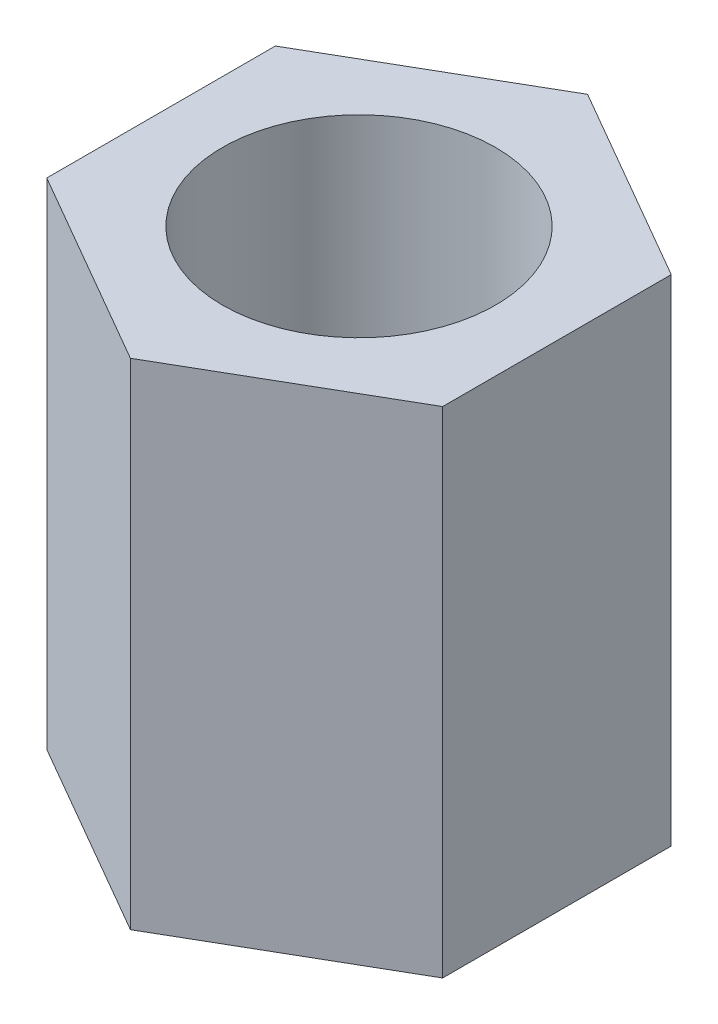
ISO-10303-21;
HEADER;
FILE_DESCRIPTION(('STEP AP214'),'2;1');
FILE_NAME('part.step','',(''),(''),'','','');
FILE_SCHEMA(('AUTOMOTIVE_DESIGN { 1 0 10303 214 1 1 1 1 }'));
ENDSEC;
DATA;
#1=APPLICATION_CONTEXT('core data for automotive mechanical design processes');
#2=APPLICATION_PROTOCOL_DEFINITION('international standard','automotive_design',2000,#1);
#3=PRODUCT_CONTEXT('',#1,'mechanical');
#4=PRODUCT('Part','Part','',(#3));
#5=PRODUCT_RELATED_PRODUCT_CATEGORY('part','',(#4));
#6=PRODUCT_DEFINITION_FORMATION('','',#4);
#7=PRODUCT_DEFINITION_CONTEXT('part definition',#1,'design');
#8=PRODUCT_DEFINITION('design','',#6,#7);
#9=PRODUCT_DEFINITION_SHAPE('','',#8);
#10=(LENGTH_UNIT() NAMED_UNIT(*) SI_UNIT(.MILLI.,.METRE.));
#11=(NAMED_UNIT(*) PLANE_ANGLE_UNIT() SI_UNIT($,.RADIAN.));
#12=(NAMED_UNIT(*) SI_UNIT($,.STERADIAN.) SOLID_ANGLE_UNIT());
#13=UNCERTAINTY_MEASURE_WITH_UNIT(LENGTH_MEASURE(1.E-05),#10,'distance_accuracy_value','');
#14=(GEOMETRIC_REPRESENTATION_CONTEXT(3) GLOBAL_UNCERTAINTY_ASSIGNED_CONTEXT((#13)) GLOBAL_UNIT_ASSIGNED_CONTEXT((#10,
#11,#12)) REPRESENTATION_CONTEXT('',''));
#15=CARTESIAN_POINT('',(0.,0.,0.));
#16=DIRECTION('',(0.,0.,1.));
#17=DIRECTION('',(1.,0.,0.));
#18=AXIS2_PLACEMENT_3D('',#15,#16,#17);
#19=CARTESIAN_POINT('',(0.,6.35,0.));
#20=DIRECTION('',(0.,1.,0.));
#21=DIRECTION('',(0.,0.,1.));
#22=AXIS2_PLACEMENT_3D('',#19,#20,#21);
#23=PLANE('',#22);
#24=DIRECTION('',(-0.866025403784442,0.,-0.499999999999995));
#25=VECTOR('',#24,1.);
#26=CARTESIAN_POINT('',(2.53999999999998,6.35,-1.46646968374168));
#27=LINE('',#26,#25);
#28=CARTESIAN_POINT('',(2.53999999999998,6.35,-1.46646968374168));
#29=VERTEX_POINT('',#28);
#30=CARTESIAN_POINT('',(0.,6.35,-2.93293936748329));
#31=VERTEX_POINT('',#30);
#32=EDGE_CURVE('E129',#29,#31,#27,.T.);
#33=ORIENTED_EDGE('',*,*,#32,.T.);
#34=DIRECTION('',(-0.866025403784438,0.,0.500000000000001));
#35=VECTOR('',#34,1.);
#36=CARTESIAN_POINT('',(0.,6.35,-2.93293936748329));
#37=LINE('',#36,#35);
#38=CARTESIAN_POINT('',(-2.54,6.35,-1.46646968374164));
#39=VERTEX_POINT('',#38);
#40=EDGE_CURVE('E87',#31,#39,#37,.T.);
#41=ORIENTED_EDGE('',*,*,#40,.T.);
#42=DIRECTION('',(0.,0.,1.));
#43=VECTOR('',#42,1.);
#44=CARTESIAN_POINT('',(-2.54,6.35,-1.46646968374164));
#45=LINE('',#44,#43);
#46=CARTESIAN_POINT('',(-2.53999999999999,6.35,1.46646968374166));
#47=VERTEX_POINT('',#46);
#48=EDGE_CURVE('E100',#39,#47,#45,.T.);
#49=ORIENTED_EDGE('',*,*,#48,.T.);
#50=DIRECTION('',(0.866025403784442,0.,0.499999999999995));
#51=VECTOR('',#50,1.);
#52=CARTESIAN_POINT('',(-2.53999999999999,6.35,1.46646968374166));
#53=LINE('',#52,#51);
#54=CARTESIAN_POINT('',(0.,6.35,2.93293936748329));
#55=VERTEX_POINT('',#54);
#56=EDGE_CURVE('E94',#47,#55,#53,.T.);
#57=ORIENTED_EDGE('',*,*,#56,.T.);
#58=DIRECTION('',(0.866025403784435,0.,-0.500000000000007));
#59=VECTOR('',#58,1.);
#60=CARTESIAN_POINT('',(0.,6.35,2.93293936748329));
#61=LINE('',#60,#59);
#62=CARTESIAN_POINT('',(2.54000000000001,6.35,1.46646968374162));
#63=VERTEX_POINT('',#62);
#64=EDGE_CURVE('E98',#55,#63,#61,.T.);
#65=ORIENTED_EDGE('',*,*,#64,.T.);
#66=DIRECTION('',(0.,0.,-1.));
#67=VECTOR('',#66,1.);
#68=CARTESIAN_POINT('',(2.54000000000001,6.35,1.46646968374162));
#69=LINE('',#68,#67);
#70=EDGE_CURVE('E50',#63,#29,#69,.T.);
#71=ORIENTED_EDGE('',*,*,#70,.T.);
#72=EDGE_LOOP('',(#33,#41,#49,#57,#65,#71));
#73=FACE_BOUND('',#72,.T.);
#74=CARTESIAN_POINT('',(0.,6.35,0.));
#75=DIRECTION('',(0.,1.,0.));
#76=DIRECTION('',(0.,0.,1.));
#77=AXIS2_PLACEMENT_3D('',#74,#75,#76);
#78=CIRCLE('',#77,1.7526);
#79=CARTESIAN_POINT('',(0.,6.35,1.7526));
#80=VERTEX_POINT('',#79);
#81=EDGE_CURVE('E122',#80,#80,#78,.T.);
#82=ORIENTED_EDGE('',*,*,#81,.F.);
#83=EDGE_LOOP('',(#82));
#84=FACE_BOUND('',#83,.T.);
#85=ADVANCED_FACE('F33',(#73,#84),#23,.T.);
#86=CARTESIAN_POINT('',(0.,0.,0.));
#87=DIRECTION('',(0.,1.,0.));
#88=DIRECTION('',(0.,0.,1.));
#89=AXIS2_PLACEMENT_3D('',#86,#87,#88);
#90=PLANE('',#89);
#91=DIRECTION('',(-0.866025403784442,0.,-0.499999999999995));
#92=VECTOR('',#91,1.);
#93=CARTESIAN_POINT('',(2.53999999999998,0.,-1.46646968374168));
#94=LINE('',#93,#92);
#95=CARTESIAN_POINT('',(2.53999999999998,0.,-1.46646968374168));
#96=VERTEX_POINT('',#95);
#97=CARTESIAN_POINT('',(0.,0.,-2.93293936748329));
#98=VERTEX_POINT('',#97);
#99=EDGE_CURVE('E118',#96,#98,#94,.T.);
#100=ORIENTED_EDGE('',*,*,#99,.F.);
#101=DIRECTION('',(0.,0.,-1.));
#102=VECTOR('',#101,1.);
#103=CARTESIAN_POINT('',(2.54000000000001,0.,1.46646968374162));
#104=LINE('',#103,#102);
#105=CARTESIAN_POINT('',(2.54000000000001,0.,1.46646968374162));
#106=VERTEX_POINT('',#105);
#107=EDGE_CURVE('E79',#106,#96,#104,.T.);
#108=ORIENTED_EDGE('',*,*,#107,.F.);
#109=DIRECTION('',(0.866025403784435,0.,-0.500000000000007));
#110=VECTOR('',#109,1.);
#111=CARTESIAN_POINT('',(0.,0.,2.93293936748329));
#112=LINE('',#111,#110);
#113=CARTESIAN_POINT('',(0.,0.,2.93293936748329));
#114=VERTEX_POINT('',#113);
#115=EDGE_CURVE('E73',#114,#106,#112,.T.);
#116=ORIENTED_EDGE('',*,*,#115,.F.);
#117=DIRECTION('',(0.866025403784442,0.,0.499999999999995));
#118=VECTOR('',#117,1.);
#119=CARTESIAN_POINT('',(-2.53999999999999,0.,1.46646968374166));
#120=LINE('',#119,#118);
#121=CARTESIAN_POINT('',(-2.53999999999999,0.,1.46646968374166));
#122=VERTEX_POINT('',#121);
#123=EDGE_CURVE('E108',#122,#114,#120,.T.);
#124=ORIENTED_EDGE('',*,*,#123,.F.);
#125=DIRECTION('',(0.,0.,1.));
#126=VECTOR('',#125,1.);
#127=CARTESIAN_POINT('',(-2.54,0.,-1.46646968374164));
#128=LINE('',#127,#126);
#129=CARTESIAN_POINT('',(-2.54,0.,-1.46646968374164));
#130=VERTEX_POINT('',#129);
#131=EDGE_CURVE('E124',#130,#122,#128,.T.);
#132=ORIENTED_EDGE('',*,*,#131,.F.);
#133=DIRECTION('',(-0.866025403784438,0.,0.500000000000001));
#134=VECTOR('',#133,1.);
#135=CARTESIAN_POINT('',(0.,0.,-2.93293936748329));
#136=LINE('',#135,#134);
#137=EDGE_CURVE('E121',#98,#130,#136,.T.);
#138=ORIENTED_EDGE('',*,*,#137,.F.);
#139=EDGE_LOOP('',(#100,#108,#116,#124,#132,#138));
#140=FACE_BOUND('',#139,.T.);
#141=CARTESIAN_POINT('',(0.,0.,0.));
#142=DIRECTION('',(0.,1.,0.));
#143=DIRECTION('',(0.,0.,1.));
#144=AXIS2_PLACEMENT_3D('',#141,#142,#143);
#145=CIRCLE('',#144,1.7526);
#146=CARTESIAN_POINT('',(0.,0.,1.7526));
#147=VERTEX_POINT('',#146);
#148=EDGE_CURVE('E222',#147,#147,#145,.T.);
#149=ORIENTED_EDGE('',*,*,#148,.T.);
#150=EDGE_LOOP('',(#149));
#151=FACE_BOUND('',#150,.T.);
#152=ADVANCED_FACE('F138',(#140,#151),#90,.F.);
#153=CARTESIAN_POINT('',(2.53999999999998,6.35,-1.46646968374168));
#154=DIRECTION('',(-0.499999999999995,0.,0.866025403784442));
#155=DIRECTION('',(0.866025403784442,0.,0.499999999999995));
#156=AXIS2_PLACEMENT_3D('',#153,#154,#155);
#157=PLANE('',#156);
#158=ORIENTED_EDGE('',*,*,#99,.T.);
#159=DIRECTION('',(0.,-1.,0.));
#160=VECTOR('',#159,1.);
#161=CARTESIAN_POINT('',(0.,6.35,-2.93293936748329));
#162=LINE('',#161,#160);
#163=EDGE_CURVE('E11',#31,#98,#162,.T.);
#164=ORIENTED_EDGE('',*,*,#163,.F.);
#165=ORIENTED_EDGE('',*,*,#32,.F.);
#166=DIRECTION('',(0.,-1.,0.));
#167=VECTOR('',#166,1.);
#168=CARTESIAN_POINT('',(2.53999999999998,6.35,-1.46646968374168));
#169=LINE('',#168,#167);
#170=EDGE_CURVE('E114',#29,#96,#169,.T.);
#171=ORIENTED_EDGE('',*,*,#170,.T.);
#172=EDGE_LOOP('',(#158,#164,#165,#171));
#173=FACE_BOUND('',#172,.T.);
#174=ADVANCED_FACE('F35',(#173),#157,.F.);
#175=CARTESIAN_POINT('',(0.,6.35,-2.93293936748329));
#176=DIRECTION('',(0.500000000000001,0.,0.866025403784438));
#177=DIRECTION('',(0.866025403784438,0.,-0.500000000000001));
#178=AXIS2_PLACEMENT_3D('',#175,#176,#177);
#179=PLANE('',#178);
#180=ORIENTED_EDGE('',*,*,#137,.T.);
#181=DIRECTION('',(0.,-1.,0.));
#182=VECTOR('',#181,1.);
#183=CARTESIAN_POINT('',(-2.54,6.35,-1.46646968374164));
#184=LINE('',#183,#182);
#185=EDGE_CURVE('E42',#39,#130,#184,.T.);
#186=ORIENTED_EDGE('',*,*,#185,.F.);
#187=ORIENTED_EDGE('',*,*,#40,.F.);
#188=ORIENTED_EDGE('',*,*,#163,.T.);
#189=EDGE_LOOP('',(#180,#186,#187,#188));
#190=FACE_BOUND('',#189,.T.);
#191=ADVANCED_FACE('F163',(#190),#179,.F.);
#192=CARTESIAN_POINT('',(-2.54,6.35,-1.46646968374164));
#193=DIRECTION('',(1.,0.,0.));
#194=DIRECTION('',(0.,0.,-1.));
#195=AXIS2_PLACEMENT_3D('',#192,#193,#194);
#196=PLANE('',#195);
#197=ORIENTED_EDGE('',*,*,#131,.T.);
#198=DIRECTION('',(0.,-1.,0.));
#199=VECTOR('',#198,1.);
#200=CARTESIAN_POINT('',(-2.53999999999999,6.35,1.46646968374166));
#201=LINE('',#200,#199);
#202=EDGE_CURVE('E109',#47,#122,#201,.T.);
#203=ORIENTED_EDGE('',*,*,#202,.F.);
#204=ORIENTED_EDGE('',*,*,#48,.F.);
#205=ORIENTED_EDGE('',*,*,#185,.T.);
#206=EDGE_LOOP('',(#197,#203,#204,#205));
#207=FACE_BOUND('',#206,.T.);
#208=ADVANCED_FACE('F135',(#207),#196,.F.);
#209=CARTESIAN_POINT('',(-2.53999999999999,6.35,1.46646968374166));
#210=DIRECTION('',(0.499999999999995,0.,-0.866025403784441));
#211=DIRECTION('',(-0.866025403784442,0.,-0.499999999999995));
#212=AXIS2_PLACEMENT_3D('',#209,#210,#211);
#213=PLANE('',#212);
#214=ORIENTED_EDGE('',*,*,#123,.T.);
#215=DIRECTION('',(0.,-1.,0.));
#216=VECTOR('',#215,1.);
#217=CARTESIAN_POINT('',(0.,6.35,2.93293936748329));
#218=LINE('',#217,#216);
#219=EDGE_CURVE('E105',#55,#114,#218,.T.);
#220=ORIENTED_EDGE('',*,*,#219,.F.);
#221=ORIENTED_EDGE('',*,*,#56,.F.);
#222=ORIENTED_EDGE('',*,*,#202,.T.);
#223=EDGE_LOOP('',(#214,#220,#221,#222));
#224=FACE_BOUND('',#223,.T.);
#225=ADVANCED_FACE('F106',(#224),#213,.F.);
#226=CARTESIAN_POINT('',(0.,6.35,2.93293936748329));
#227=DIRECTION('',(-0.500000000000007,0.,-0.866025403784435));
#228=DIRECTION('',(-0.866025403784435,0.,0.500000000000007));
#229=AXIS2_PLACEMENT_3D('',#226,#227,#228);
#230=PLANE('',#229);
#231=ORIENTED_EDGE('',*,*,#115,.T.);
#232=DIRECTION('',(0.,-1.,0.));
#233=VECTOR('',#232,1.);
#234=CARTESIAN_POINT('',(2.54000000000001,6.35,1.46646968374162));
#235=LINE('',#234,#233);
#236=EDGE_CURVE('E110',#63,#106,#235,.T.);
#237=ORIENTED_EDGE('',*,*,#236,.F.);
#238=ORIENTED_EDGE('',*,*,#64,.F.);
#239=ORIENTED_EDGE('',*,*,#219,.T.);
#240=EDGE_LOOP('',(#231,#237,#238,#239));
#241=FACE_BOUND('',#240,.T.);
#242=ADVANCED_FACE('F112',(#241),#230,.F.);
#243=CARTESIAN_POINT('',(2.54000000000001,6.35,1.46646968374162));
#244=DIRECTION('',(-1.,0.,0.));
#245=DIRECTION('',(0.,0.,1.));
#246=AXIS2_PLACEMENT_3D('',#243,#244,#245);
#247=PLANE('',#246);
#248=ORIENTED_EDGE('',*,*,#107,.T.);
#249=ORIENTED_EDGE('',*,*,#170,.F.);
#250=ORIENTED_EDGE('',*,*,#70,.F.);
#251=ORIENTED_EDGE('',*,*,#236,.T.);
#252=EDGE_LOOP('',(#248,#249,#250,#251));
#253=FACE_BOUND('',#252,.T.);
#254=ADVANCED_FACE('F143',(#253),#247,.F.);
#255=CARTESIAN_POINT('',(0.,6.35,0.));
#256=DIRECTION('',(0.,-1.,0.));
#257=DIRECTION('',(0.,0.,-1.));
#258=AXIS2_PLACEMENT_3D('',#255,#256,#257);
#259=CYLINDRICAL_SURFACE('',#258,1.7526);
#260=ORIENTED_EDGE('',*,*,#81,.T.);
#261=EDGE_LOOP('',(#260));
#262=FACE_BOUND('',#261,.T.);
#263=ORIENTED_EDGE('',*,*,#148,.F.);
#264=EDGE_LOOP('',(#263));
#265=FACE_BOUND('',#264,.T.);
#266=ADVANCED_FACE('F145',(#262,#265),#259,.F.);
#267=CLOSED_SHELL('',(#85,#152,#174,#191,#208,#225,#242,#254,#266));
#268=MANIFOLD_SOLID_BREP('B2',#267);
#269=ADVANCED_BREP_SHAPE_REPRESENTATION('',(#18,#268),#14);
#270=SHAPE_DEFINITION_REPRESENTATION(#9,#269);
ENDSEC;
END-ISO-10303-21;
